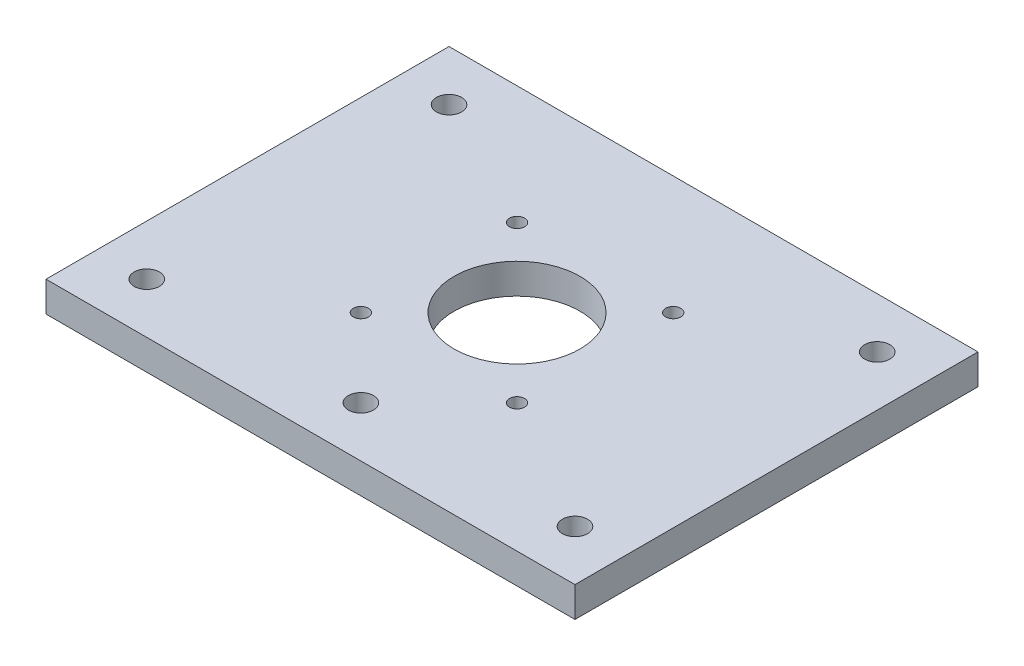
ISO-10303-21;
HEADER;
FILE_DESCRIPTION(('STEP AP214'),'2;1');
FILE_NAME('part.step','',(''),(''),'','','');
FILE_SCHEMA(('AUTOMOTIVE_DESIGN { 1 0 10303 214 1 1 1 1 }'));
ENDSEC;
DATA;
#1=APPLICATION_CONTEXT('core data for automotive mechanical design processes');
#2=APPLICATION_PROTOCOL_DEFINITION('international standard','automotive_design',2000,#1);
#3=PRODUCT_CONTEXT('',#1,'mechanical');
#4=PRODUCT('Part','Part','',(#3));
#5=PRODUCT_RELATED_PRODUCT_CATEGORY('part','',(#4));
#6=PRODUCT_DEFINITION_FORMATION('','',#4);
#7=PRODUCT_DEFINITION_CONTEXT('part definition',#1,'design');
#8=PRODUCT_DEFINITION('design','',#6,#7);
#9=PRODUCT_DEFINITION_SHAPE('','',#8);
#10=(LENGTH_UNIT() NAMED_UNIT(*) SI_UNIT(.MILLI.,.METRE.));
#11=(NAMED_UNIT(*) PLANE_ANGLE_UNIT() SI_UNIT($,.RADIAN.));
#12=(NAMED_UNIT(*) SI_UNIT($,.STERADIAN.) SOLID_ANGLE_UNIT());
#13=UNCERTAINTY_MEASURE_WITH_UNIT(LENGTH_MEASURE(1.E-05),#10,'distance_accuracy_value','');
#14=(GEOMETRIC_REPRESENTATION_CONTEXT(3) GLOBAL_UNCERTAINTY_ASSIGNED_CONTEXT((#13)) GLOBAL_UNIT_ASSIGNED_CONTEXT((#10,
#11,#12)) REPRESENTATION_CONTEXT('',''));
#15=CARTESIAN_POINT('',(0.,0.,0.));
#16=DIRECTION('',(0.,0.,1.));
#17=DIRECTION('',(1.,0.,0.));
#18=AXIS2_PLACEMENT_3D('',#15,#16,#17);
#19=CARTESIAN_POINT('',(52.5,6.,-80.));
#20=DIRECTION('',(-1.,0.,0.));
#21=DIRECTION('',(0.,0.,1.));
#22=AXIS2_PLACEMENT_3D('',#19,#20,#21);
#23=PLANE('',#22);
#24=DIRECTION('',(0.,0.,-1.));
#25=VECTOR('',#24,1.);
#26=CARTESIAN_POINT('',(52.5,0.,-80.));
#27=LINE('',#26,#25);
#28=CARTESIAN_POINT('',(52.5,0.,0.));
#29=VERTEX_POINT('',#28);
#30=CARTESIAN_POINT('',(52.5,0.,-80.));
#31=VERTEX_POINT('',#30);
#32=EDGE_CURVE('E87',#29,#31,#27,.T.);
#33=ORIENTED_EDGE('',*,*,#32,.T.);
#34=DIRECTION('',(0.,-1.,0.));
#35=VECTOR('',#34,1.);
#36=CARTESIAN_POINT('',(52.5,6.,-80.));
#37=LINE('',#36,#35);
#38=CARTESIAN_POINT('',(52.5,6.,-80.));
#39=VERTEX_POINT('',#38);
#40=EDGE_CURVE('E41',#39,#31,#37,.T.);
#41=ORIENTED_EDGE('',*,*,#40,.F.);
#42=DIRECTION('',(0.,0.,-1.));
#43=VECTOR('',#42,1.);
#44=CARTESIAN_POINT('',(52.5,6.,-80.));
#45=LINE('',#44,#43);
#46=CARTESIAN_POINT('',(52.5,6.,0.));
#47=VERTEX_POINT('',#46);
#48=EDGE_CURVE('E80',#47,#39,#45,.T.);
#49=ORIENTED_EDGE('',*,*,#48,.F.);
#50=DIRECTION('',(0.,-1.,0.));
#51=VECTOR('',#50,1.);
#52=CARTESIAN_POINT('',(52.5,6.,0.));
#53=LINE('',#52,#51);
#54=EDGE_CURVE('E11',#47,#29,#53,.T.);
#55=ORIENTED_EDGE('',*,*,#54,.T.);
#56=EDGE_LOOP('',(#33,#41,#49,#55));
#57=FACE_BOUND('',#56,.T.);
#58=ADVANCED_FACE('F33',(#57),#23,.F.);
#59=CARTESIAN_POINT('',(-52.5,6.,-80.));
#60=DIRECTION('',(0.,0.,1.));
#61=DIRECTION('',(1.,0.,0.));
#62=AXIS2_PLACEMENT_3D('',#59,#60,#61);
#63=PLANE('',#62);
#64=DIRECTION('',(-1.,0.,0.));
#65=VECTOR('',#64,1.);
#66=CARTESIAN_POINT('',(-52.5,0.,-80.));
#67=LINE('',#66,#65);
#68=CARTESIAN_POINT('',(-52.5,0.,-80.));
#69=VERTEX_POINT('',#68);
#70=EDGE_CURVE('E67',#31,#69,#67,.T.);
#71=ORIENTED_EDGE('',*,*,#70,.T.);
#72=DIRECTION('',(0.,-1.,0.));
#73=VECTOR('',#72,1.);
#74=CARTESIAN_POINT('',(-52.5,6.,-80.));
#75=LINE('',#74,#73);
#76=CARTESIAN_POINT('',(-52.5,6.,-80.));
#77=VERTEX_POINT('',#76);
#78=EDGE_CURVE('E88',#77,#69,#75,.T.);
#79=ORIENTED_EDGE('',*,*,#78,.F.);
#80=DIRECTION('',(-1.,0.,0.));
#81=VECTOR('',#80,1.);
#82=CARTESIAN_POINT('',(-52.5,6.,-80.));
#83=LINE('',#82,#81);
#84=EDGE_CURVE('E84',#39,#77,#83,.T.);
#85=ORIENTED_EDGE('',*,*,#84,.F.);
#86=ORIENTED_EDGE('',*,*,#40,.T.);
#87=EDGE_LOOP('',(#71,#79,#85,#86));
#88=FACE_BOUND('',#87,.T.);
#89=ADVANCED_FACE('F89',(#88),#63,.F.);
#90=CARTESIAN_POINT('',(-52.5,6.,0.));
#91=DIRECTION('',(1.,0.,0.));
#92=DIRECTION('',(0.,0.,-1.));
#93=AXIS2_PLACEMENT_3D('',#90,#91,#92);
#94=PLANE('',#93);
#95=DIRECTION('',(0.,0.,1.));
#96=VECTOR('',#95,1.);
#97=CARTESIAN_POINT('',(-52.5,0.,0.));
#98=LINE('',#97,#96);
#99=CARTESIAN_POINT('',(-52.5,0.,0.));
#100=VERTEX_POINT('',#99);
#101=EDGE_CURVE('E74',#69,#100,#98,.T.);
#102=ORIENTED_EDGE('',*,*,#101,.T.);
#103=DIRECTION('',(0.,-1.,0.));
#104=VECTOR('',#103,1.);
#105=CARTESIAN_POINT('',(-52.5,6.,0.));
#106=LINE('',#105,#104);
#107=CARTESIAN_POINT('',(-52.5,6.,0.));
#108=VERTEX_POINT('',#107);
#109=EDGE_CURVE('E93',#108,#100,#106,.T.);
#110=ORIENTED_EDGE('',*,*,#109,.F.);
#111=DIRECTION('',(0.,0.,1.));
#112=VECTOR('',#111,1.);
#113=CARTESIAN_POINT('',(-52.5,6.,0.));
#114=LINE('',#113,#112);
#115=EDGE_CURVE('E91',#77,#108,#114,.T.);
#116=ORIENTED_EDGE('',*,*,#115,.F.);
#117=ORIENTED_EDGE('',*,*,#78,.T.);
#118=EDGE_LOOP('',(#102,#110,#116,#117));
#119=FACE_BOUND('',#118,.T.);
#120=ADVANCED_FACE('F104',(#119),#94,.F.);
#121=CARTESIAN_POINT('',(0.,6.,0.));
#122=DIRECTION('',(0.,0.,-1.));
#123=DIRECTION('',(-1.,0.,0.));
#124=AXIS2_PLACEMENT_3D('',#121,#122,#123);
#125=PLANE('',#124);
#126=DIRECTION('',(1.,0.,0.));
#127=VECTOR('',#126,1.);
#128=CARTESIAN_POINT('',(0.,0.,0.));
#129=LINE('',#128,#127);
#130=EDGE_CURVE('E101',#100,#29,#129,.T.);
#131=ORIENTED_EDGE('',*,*,#130,.T.);
#132=ORIENTED_EDGE('',*,*,#54,.F.);
#133=DIRECTION('',(1.,0.,0.));
#134=VECTOR('',#133,1.);
#135=CARTESIAN_POINT('',(52.5,6.,0.));
#136=LINE('',#135,#134);
#137=EDGE_CURVE('E49',#108,#47,#136,.T.);
#138=ORIENTED_EDGE('',*,*,#137,.F.);
#139=ORIENTED_EDGE('',*,*,#109,.T.);
#140=EDGE_LOOP('',(#131,#132,#138,#139));
#141=FACE_BOUND('',#140,.T.);
#142=ADVANCED_FACE('F108',(#141),#125,.F.);
#143=CARTESIAN_POINT('',(0.,6.,0.));
#144=DIRECTION('',(0.,-1.,0.));
#145=DIRECTION('',(0.,0.,-1.));
#146=AXIS2_PLACEMENT_3D('',#143,#144,#145);
#147=PLANE('',#146);
#148=CARTESIAN_POINT('',(15.5,6.,-25.5));
#149=DIRECTION('',(0.,1.,0.));
#150=DIRECTION('',(0.,0.,1.));
#151=AXIS2_PLACEMENT_3D('',#148,#149,#150);
#152=CIRCLE('',#151,1.5);
#153=CARTESIAN_POINT('',(15.5,6.,-24.));
#154=VERTEX_POINT('',#153);
#155=EDGE_CURVE('E258',#154,#154,#152,.T.);
#156=ORIENTED_EDGE('',*,*,#155,.F.);
#157=EDGE_LOOP('',(#156));
#158=FACE_BOUND('',#157,.T.);
#159=CARTESIAN_POINT('',(-15.5,6.,-25.5));
#160=DIRECTION('',(0.,1.,0.));
#161=DIRECTION('',(0.,0.,1.));
#162=AXIS2_PLACEMENT_3D('',#159,#160,#161);
#163=CIRCLE('',#162,1.5);
#164=CARTESIAN_POINT('',(-15.5,6.,-24.));
#165=VERTEX_POINT('',#164);
#166=EDGE_CURVE('E260',#165,#165,#163,.T.);
#167=ORIENTED_EDGE('',*,*,#166,.F.);
#168=EDGE_LOOP('',(#167));
#169=FACE_BOUND('',#168,.T.);
#170=CARTESIAN_POINT('',(15.5,6.,-56.5));
#171=DIRECTION('',(0.,1.,0.));
#172=DIRECTION('',(0.,0.,1.));
#173=AXIS2_PLACEMENT_3D('',#170,#171,#172);
#174=CIRCLE('',#173,1.5);
#175=CARTESIAN_POINT('',(15.5,6.,-55.));
#176=VERTEX_POINT('',#175);
#177=EDGE_CURVE('E266',#176,#176,#174,.T.);
#178=ORIENTED_EDGE('',*,*,#177,.F.);
#179=EDGE_LOOP('',(#178));
#180=FACE_BOUND('',#179,.T.);
#181=CARTESIAN_POINT('',(-15.5,6.,-56.5));
#182=DIRECTION('',(0.,1.,0.));
#183=DIRECTION('',(0.,0.,1.));
#184=AXIS2_PLACEMENT_3D('',#181,#182,#183);
#185=CIRCLE('',#184,1.5);
#186=CARTESIAN_POINT('',(-15.5,6.,-55.));
#187=VERTEX_POINT('',#186);
#188=EDGE_CURVE('E272',#187,#187,#185,.T.);
#189=ORIENTED_EDGE('',*,*,#188,.F.);
#190=EDGE_LOOP('',(#189));
#191=FACE_BOUND('',#190,.T.);
#192=CARTESIAN_POINT('',(0.,6.,-41.));
#193=DIRECTION('',(0.,1.,0.));
#194=DIRECTION('',(0.,0.,1.));
#195=AXIS2_PLACEMENT_3D('',#192,#193,#194);
#196=CIRCLE('',#195,12.5);
#197=CARTESIAN_POINT('',(0.,6.,-28.5));
#198=VERTEX_POINT('',#197);
#199=EDGE_CURVE('E278',#198,#198,#196,.T.);
#200=ORIENTED_EDGE('',*,*,#199,.F.);
#201=EDGE_LOOP('',(#200));
#202=FACE_BOUND('',#201,.T.);
#203=CARTESIAN_POINT('',(-42.5,6.,-9.99999999999999));
#204=DIRECTION('',(0.,1.,0.));
#205=DIRECTION('',(0.,0.,1.));
#206=AXIS2_PLACEMENT_3D('',#203,#204,#205);
#207=CIRCLE('',#206,2.5);
#208=CARTESIAN_POINT('',(-42.5,6.,-7.49999999999999));
#209=VERTEX_POINT('',#208);
#210=EDGE_CURVE('E284',#209,#209,#207,.T.);
#211=ORIENTED_EDGE('',*,*,#210,.F.);
#212=EDGE_LOOP('',(#211));
#213=FACE_BOUND('',#212,.T.);
#214=CARTESIAN_POINT('',(0.,6.,-9.99999999999999));
#215=DIRECTION('',(0.,1.,0.));
#216=DIRECTION('',(0.,0.,1.));
#217=AXIS2_PLACEMENT_3D('',#214,#215,#216);
#218=CIRCLE('',#217,2.5);
#219=CARTESIAN_POINT('',(0.,6.,-7.49999999999999));
#220=VERTEX_POINT('',#219);
#221=EDGE_CURVE('E290',#220,#220,#218,.T.);
#222=ORIENTED_EDGE('',*,*,#221,.F.);
#223=EDGE_LOOP('',(#222));
#224=FACE_BOUND('',#223,.T.);
#225=CARTESIAN_POINT('',(42.5,6.,-9.99999999999999));
#226=DIRECTION('',(0.,1.,0.));
#227=DIRECTION('',(0.,0.,1.));
#228=AXIS2_PLACEMENT_3D('',#225,#226,#227);
#229=CIRCLE('',#228,2.5);
#230=CARTESIAN_POINT('',(42.5,6.,-7.49999999999999));
#231=VERTEX_POINT('',#230);
#232=EDGE_CURVE('E296',#231,#231,#229,.T.);
#233=ORIENTED_EDGE('',*,*,#232,.F.);
#234=EDGE_LOOP('',(#233));
#235=FACE_BOUND('',#234,.T.);
#236=CARTESIAN_POINT('',(42.5,6.,-70.));
#237=DIRECTION('',(0.,1.,0.));
#238=DIRECTION('',(0.,0.,1.));
#239=AXIS2_PLACEMENT_3D('',#236,#237,#238);
#240=CIRCLE('',#239,2.5);
#241=CARTESIAN_POINT('',(42.5,6.,-67.5));
#242=VERTEX_POINT('',#241);
#243=EDGE_CURVE('E302',#242,#242,#240,.T.);
#244=ORIENTED_EDGE('',*,*,#243,.F.);
#245=EDGE_LOOP('',(#244));
#246=FACE_BOUND('',#245,.T.);
#247=CARTESIAN_POINT('',(-42.5,6.,-70.));
#248=DIRECTION('',(0.,1.,0.));
#249=DIRECTION('',(0.,0.,1.));
#250=AXIS2_PLACEMENT_3D('',#247,#248,#249);
#251=CIRCLE('',#250,2.5);
#252=CARTESIAN_POINT('',(-42.5,6.,-67.5));
#253=VERTEX_POINT('',#252);
#254=EDGE_CURVE('E308',#253,#253,#251,.T.);
#255=ORIENTED_EDGE('',*,*,#254,.F.);
#256=EDGE_LOOP('',(#255));
#257=FACE_BOUND('',#256,.T.);
#258=ORIENTED_EDGE('',*,*,#137,.T.);
#259=ORIENTED_EDGE('',*,*,#48,.T.);
#260=ORIENTED_EDGE('',*,*,#84,.T.);
#261=ORIENTED_EDGE('',*,*,#115,.T.);
#262=EDGE_LOOP('',(#258,#259,#260,#261));
#263=FACE_BOUND('',#262,.T.);
#264=ADVANCED_FACE('F82',(#158,#169,#180,#191,#202,#213,#224,#235,#246,#257,#263),#147,.F.);
#265=CARTESIAN_POINT('',(0.,0.,0.));
#266=DIRECTION('',(0.,-1.,0.));
#267=DIRECTION('',(0.,0.,-1.));
#268=AXIS2_PLACEMENT_3D('',#265,#266,#267);
#269=PLANE('',#268);
#270=CARTESIAN_POINT('',(15.5,0.,-25.5));
#271=DIRECTION('',(0.,1.,0.));
#272=DIRECTION('',(0.,0.,1.));
#273=AXIS2_PLACEMENT_3D('',#270,#271,#272);
#274=CIRCLE('',#273,1.5);
#275=CARTESIAN_POINT('',(15.5,0.,-24.));
#276=VERTEX_POINT('',#275);
#277=EDGE_CURVE('E255',#276,#276,#274,.T.);
#278=ORIENTED_EDGE('',*,*,#277,.T.);
#279=EDGE_LOOP('',(#278));
#280=FACE_BOUND('',#279,.T.);
#281=CARTESIAN_POINT('',(-15.5,0.,-25.5));
#282=DIRECTION('',(0.,1.,0.));
#283=DIRECTION('',(0.,0.,1.));
#284=AXIS2_PLACEMENT_3D('',#281,#282,#283);
#285=CIRCLE('',#284,1.5);
#286=CARTESIAN_POINT('',(-15.5,0.,-24.));
#287=VERTEX_POINT('',#286);
#288=EDGE_CURVE('E263',#287,#287,#285,.T.);
#289=ORIENTED_EDGE('',*,*,#288,.T.);
#290=EDGE_LOOP('',(#289));
#291=FACE_BOUND('',#290,.T.);
#292=CARTESIAN_POINT('',(15.5,0.,-56.5));
#293=DIRECTION('',(0.,1.,0.));
#294=DIRECTION('',(0.,0.,1.));
#295=AXIS2_PLACEMENT_3D('',#292,#293,#294);
#296=CIRCLE('',#295,1.5);
#297=CARTESIAN_POINT('',(15.5,0.,-55.));
#298=VERTEX_POINT('',#297);
#299=EDGE_CURVE('E269',#298,#298,#296,.T.);
#300=ORIENTED_EDGE('',*,*,#299,.T.);
#301=EDGE_LOOP('',(#300));
#302=FACE_BOUND('',#301,.T.);
#303=CARTESIAN_POINT('',(-15.5,0.,-56.5));
#304=DIRECTION('',(0.,1.,0.));
#305=DIRECTION('',(0.,0.,1.));
#306=AXIS2_PLACEMENT_3D('',#303,#304,#305);
#307=CIRCLE('',#306,1.5);
#308=CARTESIAN_POINT('',(-15.5,0.,-55.));
#309=VERTEX_POINT('',#308);
#310=EDGE_CURVE('E275',#309,#309,#307,.T.);
#311=ORIENTED_EDGE('',*,*,#310,.T.);
#312=EDGE_LOOP('',(#311));
#313=FACE_BOUND('',#312,.T.);
#314=CARTESIAN_POINT('',(0.,0.,-41.));
#315=DIRECTION('',(0.,1.,0.));
#316=DIRECTION('',(0.,0.,1.));
#317=AXIS2_PLACEMENT_3D('',#314,#315,#316);
#318=CIRCLE('',#317,12.5);
#319=CARTESIAN_POINT('',(0.,0.,-28.5));
#320=VERTEX_POINT('',#319);
#321=EDGE_CURVE('E281',#320,#320,#318,.T.);
#322=ORIENTED_EDGE('',*,*,#321,.T.);
#323=EDGE_LOOP('',(#322));
#324=FACE_BOUND('',#323,.T.);
#325=CARTESIAN_POINT('',(-42.5,0.,-9.99999999999999));
#326=DIRECTION('',(0.,1.,0.));
#327=DIRECTION('',(0.,0.,1.));
#328=AXIS2_PLACEMENT_3D('',#325,#326,#327);
#329=CIRCLE('',#328,2.5);
#330=CARTESIAN_POINT('',(-42.5,0.,-7.49999999999999));
#331=VERTEX_POINT('',#330);
#332=EDGE_CURVE('E287',#331,#331,#329,.T.);
#333=ORIENTED_EDGE('',*,*,#332,.T.);
#334=EDGE_LOOP('',(#333));
#335=FACE_BOUND('',#334,.T.);
#336=CARTESIAN_POINT('',(0.,0.,-9.99999999999999));
#337=DIRECTION('',(0.,1.,0.));
#338=DIRECTION('',(0.,0.,1.));
#339=AXIS2_PLACEMENT_3D('',#336,#337,#338);
#340=CIRCLE('',#339,2.5);
#341=CARTESIAN_POINT('',(0.,0.,-7.49999999999999));
#342=VERTEX_POINT('',#341);
#343=EDGE_CURVE('E293',#342,#342,#340,.T.);
#344=ORIENTED_EDGE('',*,*,#343,.T.);
#345=EDGE_LOOP('',(#344));
#346=FACE_BOUND('',#345,.T.);
#347=CARTESIAN_POINT('',(42.5,0.,-9.99999999999999));
#348=DIRECTION('',(0.,1.,0.));
#349=DIRECTION('',(0.,0.,1.));
#350=AXIS2_PLACEMENT_3D('',#347,#348,#349);
#351=CIRCLE('',#350,2.5);
#352=CARTESIAN_POINT('',(42.5,0.,-7.49999999999999));
#353=VERTEX_POINT('',#352);
#354=EDGE_CURVE('E299',#353,#353,#351,.T.);
#355=ORIENTED_EDGE('',*,*,#354,.T.);
#356=EDGE_LOOP('',(#355));
#357=FACE_BOUND('',#356,.T.);
#358=CARTESIAN_POINT('',(42.5,0.,-70.));
#359=DIRECTION('',(0.,1.,0.));
#360=DIRECTION('',(0.,0.,1.));
#361=AXIS2_PLACEMENT_3D('',#358,#359,#360);
#362=CIRCLE('',#361,2.5);
#363=CARTESIAN_POINT('',(42.5,0.,-67.5));
#364=VERTEX_POINT('',#363);
#365=EDGE_CURVE('E305',#364,#364,#362,.T.);
#366=ORIENTED_EDGE('',*,*,#365,.T.);
#367=EDGE_LOOP('',(#366));
#368=FACE_BOUND('',#367,.T.);
#369=CARTESIAN_POINT('',(-42.5,0.,-70.));
#370=DIRECTION('',(0.,1.,0.));
#371=DIRECTION('',(0.,0.,1.));
#372=AXIS2_PLACEMENT_3D('',#369,#370,#371);
#373=CIRCLE('',#372,2.5);
#374=CARTESIAN_POINT('',(-42.5,0.,-67.5));
#375=VERTEX_POINT('',#374);
#376=EDGE_CURVE('E98',#375,#375,#373,.T.);
#377=ORIENTED_EDGE('',*,*,#376,.T.);
#378=EDGE_LOOP('',(#377));
#379=FACE_BOUND('',#378,.T.);
#380=ORIENTED_EDGE('',*,*,#32,.F.);
#381=ORIENTED_EDGE('',*,*,#130,.F.);
#382=ORIENTED_EDGE('',*,*,#101,.F.);
#383=ORIENTED_EDGE('',*,*,#70,.F.);
#384=EDGE_LOOP('',(#380,#381,#382,#383));
#385=FACE_BOUND('',#384,.T.);
#386=ADVANCED_FACE('F107',(#280,#291,#302,#313,#324,#335,#346,#357,#368,#379,#385),#269,.T.);
#387=CARTESIAN_POINT('',(-42.5,0.,-70.));
#388=DIRECTION('',(0.,1.,0.));
#389=DIRECTION('',(0.,0.,1.));
#390=AXIS2_PLACEMENT_3D('',#387,#388,#389);
#391=CYLINDRICAL_SURFACE('',#390,2.5);
#392=ORIENTED_EDGE('',*,*,#376,.F.);
#393=EDGE_LOOP('',(#392));
#394=FACE_BOUND('',#393,.T.);
#395=ORIENTED_EDGE('',*,*,#254,.T.);
#396=EDGE_LOOP('',(#395));
#397=FACE_BOUND('',#396,.T.);
#398=ADVANCED_FACE('F149',(#394,#397),#391,.F.);
#399=CARTESIAN_POINT('',(42.5,0.,-70.));
#400=DIRECTION('',(0.,1.,0.));
#401=DIRECTION('',(0.,0.,1.));
#402=AXIS2_PLACEMENT_3D('',#399,#400,#401);
#403=CYLINDRICAL_SURFACE('',#402,2.5);
#404=ORIENTED_EDGE('',*,*,#365,.F.);
#405=EDGE_LOOP('',(#404));
#406=FACE_BOUND('',#405,.T.);
#407=ORIENTED_EDGE('',*,*,#243,.T.);
#408=EDGE_LOOP('',(#407));
#409=FACE_BOUND('',#408,.T.);
#410=ADVANCED_FACE('F158',(#406,#409),#403,.F.);
#411=CARTESIAN_POINT('',(42.5,0.,-9.99999999999999));
#412=DIRECTION('',(0.,1.,0.));
#413=DIRECTION('',(0.,0.,1.));
#414=AXIS2_PLACEMENT_3D('',#411,#412,#413);
#415=CYLINDRICAL_SURFACE('',#414,2.5);
#416=ORIENTED_EDGE('',*,*,#354,.F.);
#417=EDGE_LOOP('',(#416));
#418=FACE_BOUND('',#417,.T.);
#419=ORIENTED_EDGE('',*,*,#232,.T.);
#420=EDGE_LOOP('',(#419));
#421=FACE_BOUND('',#420,.T.);
#422=ADVANCED_FACE('F168',(#418,#421),#415,.F.);
#423=CARTESIAN_POINT('',(0.,0.,-9.99999999999999));
#424=DIRECTION('',(0.,1.,0.));
#425=DIRECTION('',(0.,0.,1.));
#426=AXIS2_PLACEMENT_3D('',#423,#424,#425);
#427=CYLINDRICAL_SURFACE('',#426,2.5);
#428=ORIENTED_EDGE('',*,*,#343,.F.);
#429=EDGE_LOOP('',(#428));
#430=FACE_BOUND('',#429,.T.);
#431=ORIENTED_EDGE('',*,*,#221,.T.);
#432=EDGE_LOOP('',(#431));
#433=FACE_BOUND('',#432,.T.);
#434=ADVANCED_FACE('F178',(#430,#433),#427,.F.);
#435=CARTESIAN_POINT('',(-42.5,0.,-9.99999999999999));
#436=DIRECTION('',(0.,1.,0.));
#437=DIRECTION('',(0.,0.,1.));
#438=AXIS2_PLACEMENT_3D('',#435,#436,#437);
#439=CYLINDRICAL_SURFACE('',#438,2.5);
#440=ORIENTED_EDGE('',*,*,#332,.F.);
#441=EDGE_LOOP('',(#440));
#442=FACE_BOUND('',#441,.T.);
#443=ORIENTED_EDGE('',*,*,#210,.T.);
#444=EDGE_LOOP('',(#443));
#445=FACE_BOUND('',#444,.T.);
#446=ADVANCED_FACE('F188',(#442,#445),#439,.F.);
#447=CARTESIAN_POINT('',(0.,0.,-41.));
#448=DIRECTION('',(0.,1.,0.));
#449=DIRECTION('',(0.,0.,1.));
#450=AXIS2_PLACEMENT_3D('',#447,#448,#449);
#451=CYLINDRICAL_SURFACE('',#450,12.5);
#452=ORIENTED_EDGE('',*,*,#321,.F.);
#453=EDGE_LOOP('',(#452));
#454=FACE_BOUND('',#453,.T.);
#455=ORIENTED_EDGE('',*,*,#199,.T.);
#456=EDGE_LOOP('',(#455));
#457=FACE_BOUND('',#456,.T.);
#458=ADVANCED_FACE('F198',(#454,#457),#451,.F.);
#459=CARTESIAN_POINT('',(-15.5,0.,-56.5));
#460=DIRECTION('',(0.,1.,0.));
#461=DIRECTION('',(0.,0.,1.));
#462=AXIS2_PLACEMENT_3D('',#459,#460,#461);
#463=CYLINDRICAL_SURFACE('',#462,1.5);
#464=ORIENTED_EDGE('',*,*,#310,.F.);
#465=EDGE_LOOP('',(#464));
#466=FACE_BOUND('',#465,.T.);
#467=ORIENTED_EDGE('',*,*,#188,.T.);
#468=EDGE_LOOP('',(#467));
#469=FACE_BOUND('',#468,.T.);
#470=ADVANCED_FACE('F208',(#466,#469),#463,.F.);
#471=CARTESIAN_POINT('',(15.5,0.,-56.5));
#472=DIRECTION('',(0.,1.,0.));
#473=DIRECTION('',(0.,0.,1.));
#474=AXIS2_PLACEMENT_3D('',#471,#472,#473);
#475=CYLINDRICAL_SURFACE('',#474,1.5);
#476=ORIENTED_EDGE('',*,*,#299,.F.);
#477=EDGE_LOOP('',(#476));
#478=FACE_BOUND('',#477,.T.);
#479=ORIENTED_EDGE('',*,*,#177,.T.);
#480=EDGE_LOOP('',(#479));
#481=FACE_BOUND('',#480,.T.);
#482=ADVANCED_FACE('F218',(#478,#481),#475,.F.);
#483=CARTESIAN_POINT('',(-15.5,0.,-25.5));
#484=DIRECTION('',(0.,1.,0.));
#485=DIRECTION('',(0.,0.,1.));
#486=AXIS2_PLACEMENT_3D('',#483,#484,#485);
#487=CYLINDRICAL_SURFACE('',#486,1.5);
#488=ORIENTED_EDGE('',*,*,#288,.F.);
#489=EDGE_LOOP('',(#488));
#490=FACE_BOUND('',#489,.T.);
#491=ORIENTED_EDGE('',*,*,#166,.T.);
#492=EDGE_LOOP('',(#491));
#493=FACE_BOUND('',#492,.T.);
#494=ADVANCED_FACE('F228',(#490,#493),#487,.F.);
#495=CARTESIAN_POINT('',(15.5,0.,-25.5));
#496=DIRECTION('',(0.,1.,0.));
#497=DIRECTION('',(0.,0.,1.));
#498=AXIS2_PLACEMENT_3D('',#495,#496,#497);
#499=CYLINDRICAL_SURFACE('',#498,1.5);
#500=ORIENTED_EDGE('',*,*,#277,.F.);
#501=EDGE_LOOP('',(#500));
#502=FACE_BOUND('',#501,.T.);
#503=ORIENTED_EDGE('',*,*,#155,.T.);
#504=EDGE_LOOP('',(#503));
#505=FACE_BOUND('',#504,.T.);
#506=ADVANCED_FACE('F238',(#502,#505),#499,.F.);
#507=CLOSED_SHELL('',(#58,#89,#120,#142,#264,#386,#398,#410,#422,#434,#446,#458,#470,#482,#494,#506));
#508=MANIFOLD_SOLID_BREP('B2',#507);
#509=ADVANCED_BREP_SHAPE_REPRESENTATION('',(#18,#508),#14);
#510=SHAPE_DEFINITION_REPRESENTATION(#9,#509);
ENDSEC;
END-ISO-10303-21;
